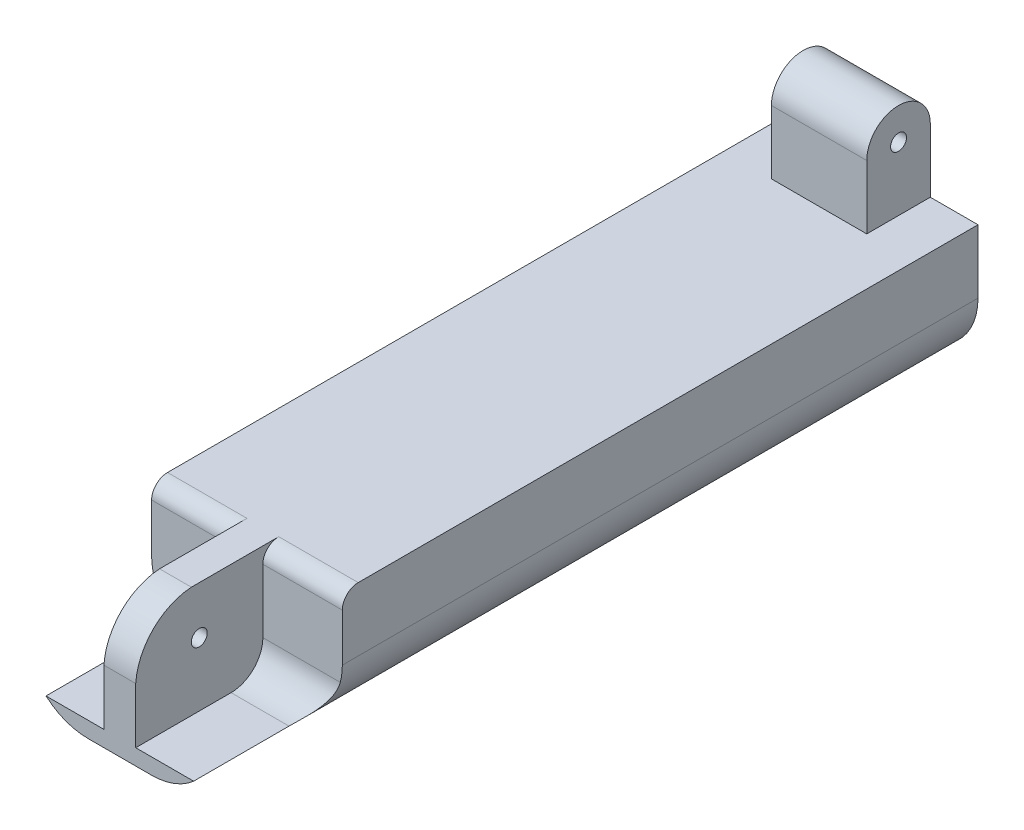
ISO-10303-21;
HEADER;
FILE_DESCRIPTION(('STEP AP214'),'2;1');
FILE_NAME('part.step','',(''),(''),'','','');
FILE_SCHEMA(('AUTOMOTIVE_DESIGN { 1 0 10303 214 1 1 1 1 }'));
ENDSEC;
DATA;
#1=APPLICATION_CONTEXT('core data for automotive mechanical design processes');
#2=APPLICATION_PROTOCOL_DEFINITION('international standard','automotive_design',2000,#1);
#3=PRODUCT_CONTEXT('',#1,'mechanical');
#4=PRODUCT('Part','Part','',(#3));
#5=PRODUCT_RELATED_PRODUCT_CATEGORY('part','',(#4));
#6=PRODUCT_DEFINITION_FORMATION('','',#4);
#7=PRODUCT_DEFINITION_CONTEXT('part definition',#1,'design');
#8=PRODUCT_DEFINITION('design','',#6,#7);
#9=PRODUCT_DEFINITION_SHAPE('','',#8);
#10=(LENGTH_UNIT() NAMED_UNIT(*) SI_UNIT(.MILLI.,.METRE.));
#11=(NAMED_UNIT(*) PLANE_ANGLE_UNIT() SI_UNIT($,.RADIAN.));
#12=(NAMED_UNIT(*) SI_UNIT($,.STERADIAN.) SOLID_ANGLE_UNIT());
#13=UNCERTAINTY_MEASURE_WITH_UNIT(LENGTH_MEASURE(1.E-05),#10,'distance_accuracy_value','');
#14=(GEOMETRIC_REPRESENTATION_CONTEXT(3) GLOBAL_UNCERTAINTY_ASSIGNED_CONTEXT((#13)) GLOBAL_UNIT_ASSIGNED_CONTEXT((#10,
#11,#12)) REPRESENTATION_CONTEXT('',''));
#15=CARTESIAN_POINT('',(0.,0.,0.));
#16=DIRECTION('',(0.,0.,1.));
#17=DIRECTION('',(1.,0.,0.));
#18=AXIS2_PLACEMENT_3D('',#15,#16,#17);
#19=CARTESIAN_POINT('',(0.,0.,0.));
#20=DIRECTION('',(0.,0.,1.));
#21=DIRECTION('',(1.,0.,0.));
#22=AXIS2_PLACEMENT_3D('',#19,#20,#21);
#23=PLANE('',#22);
#24=DIRECTION('',(1.,0.,0.));
#25=VECTOR('',#24,1.);
#26=CARTESIAN_POINT('',(-45.,60.,0.));
#27=LINE('',#26,#25);
#28=CARTESIAN_POINT('',(-45.,60.,0.));
#29=VERTEX_POINT('',#28);
#30=CARTESIAN_POINT('',(-15.,60.,0.));
#31=VERTEX_POINT('',#30);
#32=EDGE_CURVE('E179',#29,#31,#27,.T.);
#33=ORIENTED_EDGE('',*,*,#32,.T.);
#34=DIRECTION('',(0.,-1.,0.));
#35=VECTOR('',#34,1.);
#36=CARTESIAN_POINT('',(-15.,75.,0.));
#37=LINE('',#36,#35);
#38=CARTESIAN_POINT('',(-15.,40.,0.));
#39=VERTEX_POINT('',#38);
#40=EDGE_CURVE('E200',#31,#39,#37,.T.);
#41=ORIENTED_EDGE('',*,*,#40,.T.);
#42=DIRECTION('',(-1.,0.,0.));
#43=VECTOR('',#42,1.);
#44=CARTESIAN_POINT('',(0.,40.,0.));
#45=LINE('',#44,#43);
#46=CARTESIAN_POINT('',(0.,40.,0.));
#47=VERTEX_POINT('',#46);
#48=EDGE_CURVE('E267',#47,#39,#45,.T.);
#49=ORIENTED_EDGE('',*,*,#48,.F.);
#50=DIRECTION('',(0.,1.,0.));
#51=VECTOR('',#50,1.);
#52=CARTESIAN_POINT('',(0.,0.,0.));
#53=LINE('',#52,#51);
#54=CARTESIAN_POINT('',(0.,20.,0.));
#55=VERTEX_POINT('',#54);
#56=EDGE_CURVE('E239',#55,#47,#53,.T.);
#57=ORIENTED_EDGE('',*,*,#56,.F.);
#58=CARTESIAN_POINT('',(-20.,20.,0.));
#59=DIRECTION('',(0.,0.,1.));
#60=DIRECTION('',(-1.,0.,0.));
#61=AXIS2_PLACEMENT_3D('',#58,#59,#60);
#62=CIRCLE('',#61,20.);
#63=CARTESIAN_POINT('',(-20.,0.,0.));
#64=VERTEX_POINT('',#63);
#65=EDGE_CURVE('E395',#64,#55,#62,.T.);
#66=ORIENTED_EDGE('',*,*,#65,.F.);
#67=DIRECTION('',(1.,0.,0.));
#68=VECTOR('',#67,1.);
#69=CARTESIAN_POINT('',(0.,0.,0.));
#70=LINE('',#69,#68);
#71=CARTESIAN_POINT('',(-40.,0.,0.));
#72=VERTEX_POINT('',#71);
#73=EDGE_CURVE('E264',#72,#64,#70,.T.);
#74=ORIENTED_EDGE('',*,*,#73,.F.);
#75=CARTESIAN_POINT('',(-40.,20.,0.));
#76=DIRECTION('',(0.,0.,1.));
#77=DIRECTION('',(1.,0.,0.));
#78=AXIS2_PLACEMENT_3D('',#75,#76,#77);
#79=CIRCLE('',#78,20.);
#80=CARTESIAN_POINT('',(-60.,20.,0.));
#81=VERTEX_POINT('',#80);
#82=EDGE_CURVE('E400',#81,#72,#79,.T.);
#83=ORIENTED_EDGE('',*,*,#82,.F.);
#84=DIRECTION('',(0.,-1.,0.));
#85=VECTOR('',#84,1.);
#86=CARTESIAN_POINT('',(-60.,0.,0.));
#87=LINE('',#86,#85);
#88=CARTESIAN_POINT('',(-60.,40.,0.));
#89=VERTEX_POINT('',#88);
#90=EDGE_CURVE('E270',#89,#81,#87,.T.);
#91=ORIENTED_EDGE('',*,*,#90,.F.);
#92=CARTESIAN_POINT('',(-45.,40.,0.));
#93=VERTEX_POINT('',#92);
#94=EDGE_CURVE('E199',#93,#89,#45,.T.);
#95=ORIENTED_EDGE('',*,*,#94,.F.);
#96=DIRECTION('',(0.,-1.,0.));
#97=VECTOR('',#96,1.);
#98=CARTESIAN_POINT('',(-45.,75.,0.));
#99=LINE('',#98,#97);
#100=EDGE_CURVE('E192',#29,#93,#99,.T.);
#101=ORIENTED_EDGE('',*,*,#100,.F.);
#102=EDGE_LOOP('',(#33,#41,#49,#57,#66,#74,#83,#91,#95,#101));
#103=FACE_BOUND('',#102,.T.);
#104=ADVANCED_FACE('F38',(#103),#23,.F.);
#105=CARTESIAN_POINT('',(-60.,4.99999999999999,200.));
#106=DIRECTION('',(0.,0.,-1.));
#107=DIRECTION('',(-1.,0.,0.));
#108=AXIS2_PLACEMENT_3D('',#105,#106,#107);
#109=PLANE('',#108);
#110=DIRECTION('',(-1.,0.,0.));
#111=VECTOR('',#110,1.);
#112=CARTESIAN_POINT('',(-35.,35.0000000000034,200.));
#113=LINE('',#112,#111);
#114=CARTESIAN_POINT('',(-35.,35.0000000000034,200.));
#115=VERTEX_POINT('',#114);
#116=CARTESIAN_POINT('',(-60.,35.0000000000034,200.));
#117=VERTEX_POINT('',#116);
#118=EDGE_CURVE('E374',#115,#117,#113,.T.);
#119=ORIENTED_EDGE('',*,*,#118,.T.);
#120=DIRECTION('',(0.,1.,0.));
#121=VECTOR('',#120,1.);
#122=CARTESIAN_POINT('',(-60.,4.99999999999999,200.));
#123=LINE('',#122,#121);
#124=CARTESIAN_POINT('',(-60.,20.,200.));
#125=VERTEX_POINT('',#124);
#126=EDGE_CURVE('E236',#125,#117,#123,.T.);
#127=ORIENTED_EDGE('',*,*,#126,.F.);
#128=CARTESIAN_POINT('',(-40.,20.,200.));
#129=DIRECTION('',(0.,0.,-1.));
#130=DIRECTION('',(-1.,0.,0.));
#131=AXIS2_PLACEMENT_3D('',#128,#129,#130);
#132=CIRCLE('',#131,20.);
#133=CARTESIAN_POINT('',(-59.3649167310371,15.,200.));
#134=VERTEX_POINT('',#133);
#135=EDGE_CURVE('E418',#125,#134,#132,.F.);
#136=ORIENTED_EDGE('',*,*,#135,.T.);
#137=DIRECTION('',(1.,0.,0.));
#138=VECTOR('',#137,1.);
#139=CARTESIAN_POINT('',(-60.,15.,200.));
#140=LINE('',#139,#138);
#141=CARTESIAN_POINT('',(-35.,15.,200.));
#142=VERTEX_POINT('',#141);
#143=EDGE_CURVE('E217',#134,#142,#140,.T.);
#144=ORIENTED_EDGE('',*,*,#143,.T.);
#145=DIRECTION('',(0.,1.,0.));
#146=VECTOR('',#145,1.);
#147=CARTESIAN_POINT('',(-35.,4.99999999999999,200.));
#148=LINE('',#147,#146);
#149=EDGE_CURVE('E240',#142,#115,#148,.T.);
#150=ORIENTED_EDGE('',*,*,#149,.T.);
#151=EDGE_LOOP('',(#119,#127,#136,#144,#150));
#152=FACE_BOUND('',#151,.T.);
#153=ADVANCED_FACE('F327',(#152),#109,.F.);
#154=CARTESIAN_POINT('',(0.,0.,240.));
#155=DIRECTION('',(-1.,0.,0.));
#156=DIRECTION('',(0.,0.,1.));
#157=AXIS2_PLACEMENT_3D('',#154,#155,#156);
#158=PLANE('',#157);
#159=DIRECTION('',(0.,0.,-1.));
#160=VECTOR('',#159,1.);
#161=CARTESIAN_POINT('',(0.,40.,240.));
#162=LINE('',#161,#160);
#163=CARTESIAN_POINT('',(0.,40.,195.));
#164=VERTEX_POINT('',#163);
#165=EDGE_CURVE('E276',#164,#47,#162,.T.);
#166=ORIENTED_EDGE('',*,*,#165,.F.);
#167=CARTESIAN_POINT('',(0.,35.,195.));
#168=DIRECTION('',(-1.,0.,0.));
#169=DIRECTION('',(0.,0.,-1.));
#170=AXIS2_PLACEMENT_3D('',#167,#168,#169);
#171=CIRCLE('',#170,5.);
#172=CARTESIAN_POINT('',(0.,35.,200.));
#173=VERTEX_POINT('',#172);
#174=EDGE_CURVE('E376',#173,#164,#171,.T.);
#175=ORIENTED_EDGE('',*,*,#174,.F.);
#176=DIRECTION('',(0.,1.,0.));
#177=VECTOR('',#176,1.);
#178=CARTESIAN_POINT('',(0.,5.,200.));
#179=LINE('',#178,#177);
#180=CARTESIAN_POINT('',(0.,20.,200.));
#181=VERTEX_POINT('',#180);
#182=EDGE_CURVE('E250',#181,#173,#179,.T.);
#183=ORIENTED_EDGE('',*,*,#182,.F.);
#184=DIRECTION('',(0.,0.,-1.));
#185=VECTOR('',#184,1.);
#186=CARTESIAN_POINT('',(0.,20.,240.));
#187=LINE('',#186,#185);
#188=EDGE_CURVE('E411',#181,#55,#187,.T.);
#189=ORIENTED_EDGE('',*,*,#188,.T.);
#190=ORIENTED_EDGE('',*,*,#56,.T.);
#191=EDGE_LOOP('',(#166,#175,#183,#189,#190));
#192=FACE_BOUND('',#191,.T.);
#193=ADVANCED_FACE('F40',(#192),#158,.F.);
#194=CARTESIAN_POINT('',(0.,40.,240.));
#195=DIRECTION('',(0.,-1.,0.));
#196=DIRECTION('',(1.,0.,0.));
#197=AXIS2_PLACEMENT_3D('',#194,#195,#196);
#198=PLANE('',#197);
#199=DIRECTION('',(0.,0.,-1.));
#200=VECTOR('',#199,1.);
#201=CARTESIAN_POINT('',(-60.,40.,240.));
#202=LINE('',#201,#200);
#203=CARTESIAN_POINT('',(-60.,40.,195.));
#204=VERTEX_POINT('',#203);
#205=EDGE_CURVE('E263',#204,#89,#202,.T.);
#206=ORIENTED_EDGE('',*,*,#205,.F.);
#207=DIRECTION('',(-1.,0.,0.));
#208=VECTOR('',#207,1.);
#209=CARTESIAN_POINT('',(-35.,40.,195.));
#210=LINE('',#209,#208);
#211=CARTESIAN_POINT('',(-35.,40.,195.));
#212=VERTEX_POINT('',#211);
#213=EDGE_CURVE('E61',#212,#204,#210,.T.);
#214=ORIENTED_EDGE('',*,*,#213,.F.);
#215=DIRECTION('',(0.,0.,-1.));
#216=VECTOR('',#215,1.);
#217=CARTESIAN_POINT('',(-35.,40.,240.));
#218=LINE('',#217,#216);
#219=CARTESIAN_POINT('',(-35.,40.,222.5));
#220=VERTEX_POINT('',#219);
#221=EDGE_CURVE('E230',#220,#212,#218,.T.);
#222=ORIENTED_EDGE('',*,*,#221,.F.);
#223=DIRECTION('',(1.,0.,0.));
#224=VECTOR('',#223,1.);
#225=CARTESIAN_POINT('',(-45.,40.,222.5));
#226=LINE('',#225,#224);
#227=CARTESIAN_POINT('',(-25.,40.,222.5));
#228=VERTEX_POINT('',#227);
#229=EDGE_CURVE('E389',#220,#228,#226,.T.);
#230=ORIENTED_EDGE('',*,*,#229,.T.);
#231=DIRECTION('',(0.,0.,1.));
#232=VECTOR('',#231,1.);
#233=CARTESIAN_POINT('',(-25.,40.,240.));
#234=LINE('',#233,#232);
#235=CARTESIAN_POINT('',(-25.,40.,195.));
#236=VERTEX_POINT('',#235);
#237=EDGE_CURVE('E226',#236,#228,#234,.T.);
#238=ORIENTED_EDGE('',*,*,#237,.F.);
#239=DIRECTION('',(1.,0.,0.));
#240=VECTOR('',#239,1.);
#241=CARTESIAN_POINT('',(-25.,40.,195.));
#242=LINE('',#241,#240);
#243=EDGE_CURVE('E383',#236,#164,#242,.T.);
#244=ORIENTED_EDGE('',*,*,#243,.T.);
#245=ORIENTED_EDGE('',*,*,#165,.T.);
#246=ORIENTED_EDGE('',*,*,#48,.T.);
#247=DIRECTION('',(0.,0.,-1.));
#248=VECTOR('',#247,1.);
#249=CARTESIAN_POINT('',(-15.,40.,0.));
#250=LINE('',#249,#248);
#251=CARTESIAN_POINT('',(-15.,40.,20.));
#252=VERTEX_POINT('',#251);
#253=EDGE_CURVE('E201',#252,#39,#250,.T.);
#254=ORIENTED_EDGE('',*,*,#253,.F.);
#255=DIRECTION('',(1.,0.,0.));
#256=VECTOR('',#255,1.);
#257=CARTESIAN_POINT('',(-45.,40.,20.));
#258=LINE('',#257,#256);
#259=CARTESIAN_POINT('',(-45.,40.,20.));
#260=VERTEX_POINT('',#259);
#261=EDGE_CURVE('E206',#260,#252,#258,.T.);
#262=ORIENTED_EDGE('',*,*,#261,.F.);
#263=DIRECTION('',(0.,0.,1.));
#264=VECTOR('',#263,1.);
#265=CARTESIAN_POINT('',(-45.,40.,0.));
#266=LINE('',#265,#264);
#267=EDGE_CURVE('E432',#93,#260,#266,.T.);
#268=ORIENTED_EDGE('',*,*,#267,.F.);
#269=ORIENTED_EDGE('',*,*,#94,.T.);
#270=EDGE_LOOP('',(#206,#214,#222,#230,#238,#244,#245,#246,#254,#262,#268,#269));
#271=FACE_BOUND('',#270,.T.);
#272=ADVANCED_FACE('F348',(#271),#198,.F.);
#273=CARTESIAN_POINT('',(-35.,4.99999999999999,240.));
#274=DIRECTION('',(1.,0.,0.));
#275=DIRECTION('',(0.,1.,0.));
#276=AXIS2_PLACEMENT_3D('',#273,#274,#275);
#277=PLANE('',#276);
#278=CARTESIAN_POINT('',(-35.,25.,220.));
#279=DIRECTION('',(1.,0.,0.));
#280=DIRECTION('',(0.,1.,0.));
#281=AXIS2_PLACEMENT_3D('',#278,#279,#280);
#282=CIRCLE('',#281,2.5);
#283=CARTESIAN_POINT('',(-35.,27.5,220.));
#284=VERTEX_POINT('',#283);
#285=EDGE_CURVE('E429',#284,#284,#282,.T.);
#286=ORIENTED_EDGE('',*,*,#285,.T.);
#287=EDGE_LOOP('',(#286));
#288=FACE_BOUND('',#287,.T.);
#289=DIRECTION('',(0.,1.,0.));
#290=VECTOR('',#289,1.);
#291=CARTESIAN_POINT('',(-35.,4.99999999999999,240.));
#292=LINE('',#291,#290);
#293=CARTESIAN_POINT('',(-35.,4.99999999999999,240.));
#294=VERTEX_POINT('',#293);
#295=CARTESIAN_POINT('',(-35.,22.5,240.));
#296=VERTEX_POINT('',#295);
#297=EDGE_CURVE('E233',#294,#296,#292,.T.);
#298=ORIENTED_EDGE('',*,*,#297,.T.);
#299=CARTESIAN_POINT('',(-35.,21.25,221.25));
#300=DIRECTION('',(1.,0.,0.));
#301=DIRECTION('',(0.,1.,0.));
#302=AXIS2_PLACEMENT_3D('',#299,#300,#301);
#303=CIRCLE('',#302,18.7916204729662);
#304=EDGE_CURVE('E392',#296,#220,#303,.F.);
#305=ORIENTED_EDGE('',*,*,#304,.T.);
#306=ORIENTED_EDGE('',*,*,#221,.T.);
#307=CARTESIAN_POINT('',(-35.,35.,195.));
#308=DIRECTION('',(1.,0.,0.));
#309=DIRECTION('',(0.,0.,1.));
#310=AXIS2_PLACEMENT_3D('',#307,#308,#309);
#311=CIRCLE('',#310,5.00000000000001);
#312=EDGE_CURVE('E365',#212,#115,#311,.T.);
#313=ORIENTED_EDGE('',*,*,#312,.T.);
#314=ORIENTED_EDGE('',*,*,#149,.F.);
#315=CARTESIAN_POINT('',(-35.,15.,210.));
#316=DIRECTION('',(1.,0.,0.));
#317=DIRECTION('',(0.,-1.,0.));
#318=AXIS2_PLACEMENT_3D('',#315,#316,#317);
#319=CIRCLE('',#318,10.);
#320=CARTESIAN_POINT('',(-35.,4.99999999999999,210.));
#321=VERTEX_POINT('',#320);
#322=EDGE_CURVE('E212',#321,#142,#319,.T.);
#323=ORIENTED_EDGE('',*,*,#322,.F.);
#324=DIRECTION('',(0.,0.,-1.));
#325=VECTOR('',#324,1.);
#326=CARTESIAN_POINT('',(-35.,4.99999999999999,240.));
#327=LINE('',#326,#325);
#328=EDGE_CURVE('E229',#294,#321,#327,.T.);
#329=ORIENTED_EDGE('',*,*,#328,.F.);
#330=EDGE_LOOP('',(#298,#305,#306,#313,#314,#323,#329));
#331=FACE_BOUND('',#330,.T.);
#332=ADVANCED_FACE('F350',(#288,#331),#277,.F.);
#333=CARTESIAN_POINT('',(-25.,5.,240.));
#334=DIRECTION('',(-1.,0.,0.));
#335=DIRECTION('',(0.,-1.,0.));
#336=AXIS2_PLACEMENT_3D('',#333,#334,#335);
#337=PLANE('',#336);
#338=CARTESIAN_POINT('',(-25.,25.,220.));
#339=DIRECTION('',(1.,0.,0.));
#340=DIRECTION('',(0.,1.,0.));
#341=AXIS2_PLACEMENT_3D('',#338,#339,#340);
#342=CIRCLE('',#341,2.5);
#343=CARTESIAN_POINT('',(-25.,27.5,220.));
#344=VERTEX_POINT('',#343);
#345=EDGE_CURVE('E426',#344,#344,#342,.T.);
#346=ORIENTED_EDGE('',*,*,#345,.F.);
#347=EDGE_LOOP('',(#346));
#348=FACE_BOUND('',#347,.T.);
#349=ORIENTED_EDGE('',*,*,#237,.T.);
#350=CARTESIAN_POINT('',(-25.,21.25,221.25));
#351=DIRECTION('',(1.,0.,0.));
#352=DIRECTION('',(0.,1.,0.));
#353=AXIS2_PLACEMENT_3D('',#350,#351,#352);
#354=CIRCLE('',#353,18.7916204729662);
#355=CARTESIAN_POINT('',(-25.,22.5,240.));
#356=VERTEX_POINT('',#355);
#357=EDGE_CURVE('E386',#356,#228,#354,.F.);
#358=ORIENTED_EDGE('',*,*,#357,.F.);
#359=DIRECTION('',(0.,1.,0.));
#360=VECTOR('',#359,1.);
#361=CARTESIAN_POINT('',(-25.,5.,240.));
#362=LINE('',#361,#360);
#363=CARTESIAN_POINT('',(-25.,5.,240.));
#364=VERTEX_POINT('',#363);
#365=EDGE_CURVE('E235',#364,#356,#362,.T.);
#366=ORIENTED_EDGE('',*,*,#365,.F.);
#367=DIRECTION('',(0.,0.,1.));
#368=VECTOR('',#367,1.);
#369=CARTESIAN_POINT('',(-25.,5.,240.));
#370=LINE('',#369,#368);
#371=CARTESIAN_POINT('',(-25.,5.,210.));
#372=VERTEX_POINT('',#371);
#373=EDGE_CURVE('E245',#372,#364,#370,.T.);
#374=ORIENTED_EDGE('',*,*,#373,.F.);
#375=CARTESIAN_POINT('',(-25.,15.,210.));
#376=DIRECTION('',(-1.,0.,0.));
#377=DIRECTION('',(0.,1.,0.));
#378=AXIS2_PLACEMENT_3D('',#375,#376,#377);
#379=CIRCLE('',#378,10.);
#380=CARTESIAN_POINT('',(-25.,15.,200.));
#381=VERTEX_POINT('',#380);
#382=EDGE_CURVE('E219',#381,#372,#379,.T.);
#383=ORIENTED_EDGE('',*,*,#382,.F.);
#384=DIRECTION('',(0.,1.,0.));
#385=VECTOR('',#384,1.);
#386=CARTESIAN_POINT('',(-25.,5.,200.));
#387=LINE('',#386,#385);
#388=CARTESIAN_POINT('',(-25.,35.,200.));
#389=VERTEX_POINT('',#388);
#390=EDGE_CURVE('E255',#381,#389,#387,.T.);
#391=ORIENTED_EDGE('',*,*,#390,.T.);
#392=CARTESIAN_POINT('',(-25.,35.,195.));
#393=DIRECTION('',(-1.,0.,0.));
#394=DIRECTION('',(0.,0.,-1.));
#395=AXIS2_PLACEMENT_3D('',#392,#393,#394);
#396=CIRCLE('',#395,5.);
#397=EDGE_CURVE('E378',#389,#236,#396,.T.);
#398=ORIENTED_EDGE('',*,*,#397,.T.);
#399=EDGE_LOOP('',(#349,#358,#366,#374,#383,#391,#398));
#400=FACE_BOUND('',#399,.T.);
#401=ADVANCED_FACE('F342',(#348,#400),#337,.F.);
#402=CARTESIAN_POINT('',(0.,0.,240.));
#403=DIRECTION('',(0.,1.,0.));
#404=DIRECTION('',(0.,0.,1.));
#405=AXIS2_PLACEMENT_3D('',#402,#403,#404);
#406=PLANE('',#405);
#407=DIRECTION('',(0.,0.,-1.));
#408=VECTOR('',#407,1.);
#409=CARTESIAN_POINT('',(-40.,0.,240.));
#410=LINE('',#409,#408);
#411=CARTESIAN_POINT('',(-40.,0.,240.));
#412=VERTEX_POINT('',#411);
#413=EDGE_CURVE('E399',#412,#72,#410,.T.);
#414=ORIENTED_EDGE('',*,*,#413,.T.);
#415=ORIENTED_EDGE('',*,*,#73,.T.);
#416=DIRECTION('',(0.,0.,-1.));
#417=VECTOR('',#416,1.);
#418=CARTESIAN_POINT('',(-20.,0.,240.));
#419=LINE('',#418,#417);
#420=CARTESIAN_POINT('',(-20.,0.,240.));
#421=VERTEX_POINT('',#420);
#422=EDGE_CURVE('E402',#421,#64,#419,.T.);
#423=ORIENTED_EDGE('',*,*,#422,.F.);
#424=DIRECTION('',(1.,0.,0.));
#425=VECTOR('',#424,1.);
#426=CARTESIAN_POINT('',(0.,0.,240.));
#427=LINE('',#426,#425);
#428=EDGE_CURVE('E260',#412,#421,#427,.T.);
#429=ORIENTED_EDGE('',*,*,#428,.F.);
#430=EDGE_LOOP('',(#414,#415,#423,#429));
#431=FACE_BOUND('',#430,.T.);
#432=ADVANCED_FACE('F338',(#431),#406,.F.);
#433=CARTESIAN_POINT('',(0.,4.99999999999999,0.));
#434=DIRECTION('',(0.,-1.,0.));
#435=DIRECTION('',(0.,0.,-1.));
#436=AXIS2_PLACEMENT_3D('',#433,#434,#435);
#437=PLANE('',#436);
#438=DIRECTION('',(1.,0.,0.));
#439=VECTOR('',#438,1.);
#440=CARTESIAN_POINT('',(-60.,4.99999999999999,210.));
#441=LINE('',#440,#439);
#442=CARTESIAN_POINT('',(-53.2287565553229,4.99999999999999,210.));
#443=VERTEX_POINT('',#442);
#444=EDGE_CURVE('E215',#443,#321,#441,.T.);
#445=ORIENTED_EDGE('',*,*,#444,.F.);
#446=DIRECTION('',(0.,0.,-1.));
#447=VECTOR('',#446,1.);
#448=CARTESIAN_POINT('',(-53.2287565553229,4.99999999999999,240.));
#449=LINE('',#448,#447);
#450=CARTESIAN_POINT('',(-53.2287565553229,4.99999999999999,240.));
#451=VERTEX_POINT('',#450);
#452=EDGE_CURVE('E405',#443,#451,#449,.F.);
#453=ORIENTED_EDGE('',*,*,#452,.T.);
#454=DIRECTION('',(1.,0.,0.));
#455=VECTOR('',#454,1.);
#456=CARTESIAN_POINT('',(-60.,4.99999999999999,240.));
#457=LINE('',#456,#455);
#458=EDGE_CURVE('E227',#451,#294,#457,.T.);
#459=ORIENTED_EDGE('',*,*,#458,.T.);
#460=ORIENTED_EDGE('',*,*,#328,.T.);
#461=EDGE_LOOP('',(#445,#453,#459,#460));
#462=FACE_BOUND('',#461,.T.);
#463=ADVANCED_FACE('F341',(#462),#437,.F.);
#464=CARTESIAN_POINT('',(0.,5.,200.));
#465=DIRECTION('',(0.,0.,-1.));
#466=DIRECTION('',(-1.,0.,0.));
#467=AXIS2_PLACEMENT_3D('',#464,#465,#466);
#468=PLANE('',#467);
#469=ORIENTED_EDGE('',*,*,#182,.T.);
#470=DIRECTION('',(1.,0.,0.));
#471=VECTOR('',#470,1.);
#472=CARTESIAN_POINT('',(-25.,35.,200.));
#473=LINE('',#472,#471);
#474=EDGE_CURVE('E381',#389,#173,#473,.T.);
#475=ORIENTED_EDGE('',*,*,#474,.F.);
#476=ORIENTED_EDGE('',*,*,#390,.F.);
#477=DIRECTION('',(-1.,0.,0.));
#478=VECTOR('',#477,1.);
#479=CARTESIAN_POINT('',(0.,15.,200.));
#480=LINE('',#479,#478);
#481=CARTESIAN_POINT('',(-0.635083268962916,15.,200.));
#482=VERTEX_POINT('',#481);
#483=EDGE_CURVE('E222',#482,#381,#480,.T.);
#484=ORIENTED_EDGE('',*,*,#483,.F.);
#485=CARTESIAN_POINT('',(-20.,20.,200.));
#486=DIRECTION('',(0.,0.,-1.));
#487=DIRECTION('',(-1.,0.,0.));
#488=AXIS2_PLACEMENT_3D('',#485,#486,#487);
#489=CIRCLE('',#488,20.);
#490=EDGE_CURVE('E423',#482,#181,#489,.F.);
#491=ORIENTED_EDGE('',*,*,#490,.T.);
#492=EDGE_LOOP('',(#469,#475,#476,#484,#491));
#493=FACE_BOUND('',#492,.T.);
#494=ADVANCED_FACE('F491',(#493),#468,.F.);
#495=CARTESIAN_POINT('',(0.,5.,0.));
#496=DIRECTION('',(0.,1.,0.));
#497=DIRECTION('',(0.,0.,1.));
#498=AXIS2_PLACEMENT_3D('',#495,#496,#497);
#499=PLANE('',#498);
#500=DIRECTION('',(0.,0.,-1.));
#501=VECTOR('',#500,1.);
#502=CARTESIAN_POINT('',(-6.77124344467705,5.,240.));
#503=LINE('',#502,#501);
#504=CARTESIAN_POINT('',(-6.77124344467705,4.99999999999999,210.));
#505=VERTEX_POINT('',#504);
#506=CARTESIAN_POINT('',(-6.77124344467705,5.,240.));
#507=VERTEX_POINT('',#506);
#508=EDGE_CURVE('E421',#505,#507,#503,.F.);
#509=ORIENTED_EDGE('',*,*,#508,.F.);
#510=DIRECTION('',(-1.,0.,0.));
#511=VECTOR('',#510,1.);
#512=CARTESIAN_POINT('',(0.,5.,210.));
#513=LINE('',#512,#511);
#514=EDGE_CURVE('E224',#505,#372,#513,.T.);
#515=ORIENTED_EDGE('',*,*,#514,.T.);
#516=ORIENTED_EDGE('',*,*,#373,.T.);
#517=DIRECTION('',(1.,0.,0.));
#518=VECTOR('',#517,1.);
#519=CARTESIAN_POINT('',(0.,5.,240.));
#520=LINE('',#519,#518);
#521=EDGE_CURVE('E247',#364,#507,#520,.T.);
#522=ORIENTED_EDGE('',*,*,#521,.T.);
#523=EDGE_LOOP('',(#509,#515,#516,#522));
#524=FACE_BOUND('',#523,.T.);
#525=ADVANCED_FACE('F346',(#524),#499,.T.);
#526=CARTESIAN_POINT('',(-60.,0.,240.));
#527=DIRECTION('',(1.,0.,0.));
#528=DIRECTION('',(0.,0.,-1.));
#529=AXIS2_PLACEMENT_3D('',#526,#527,#528);
#530=PLANE('',#529);
#531=ORIENTED_EDGE('',*,*,#126,.T.);
#532=CARTESIAN_POINT('',(-60.,35.,195.));
#533=DIRECTION('',(1.,0.,0.));
#534=DIRECTION('',(0.,0.,1.));
#535=AXIS2_PLACEMENT_3D('',#532,#533,#534);
#536=CIRCLE('',#535,5.00000000000001);
#537=EDGE_CURVE('E362',#204,#117,#536,.T.);
#538=ORIENTED_EDGE('',*,*,#537,.F.);
#539=ORIENTED_EDGE('',*,*,#205,.T.);
#540=ORIENTED_EDGE('',*,*,#90,.T.);
#541=DIRECTION('',(0.,0.,-1.));
#542=VECTOR('',#541,1.);
#543=CARTESIAN_POINT('',(-60.,20.,240.));
#544=LINE('',#543,#542);
#545=EDGE_CURVE('E403',#125,#81,#544,.T.);
#546=ORIENTED_EDGE('',*,*,#545,.F.);
#547=EDGE_LOOP('',(#531,#538,#539,#540,#546));
#548=FACE_BOUND('',#547,.T.);
#549=ADVANCED_FACE('F344',(#548),#530,.F.);
#550=CARTESIAN_POINT('',(0.,0.,240.));
#551=DIRECTION('',(0.,0.,1.));
#552=DIRECTION('',(1.,0.,0.));
#553=AXIS2_PLACEMENT_3D('',#550,#551,#552);
#554=PLANE('',#553);
#555=DIRECTION('',(1.,0.,0.));
#556=VECTOR('',#555,1.);
#557=CARTESIAN_POINT('',(-45.,22.5,240.));
#558=LINE('',#557,#556);
#559=EDGE_CURVE('E11',#296,#356,#558,.T.);
#560=ORIENTED_EDGE('',*,*,#559,.F.);
#561=ORIENTED_EDGE('',*,*,#297,.F.);
#562=ORIENTED_EDGE('',*,*,#458,.F.);
#563=CARTESIAN_POINT('',(-40.,20.,240.));
#564=DIRECTION('',(0.,0.,1.));
#565=DIRECTION('',(1.,0.,0.));
#566=AXIS2_PLACEMENT_3D('',#563,#564,#565);
#567=CIRCLE('',#566,20.);
#568=EDGE_CURVE('E396',#451,#412,#567,.T.);
#569=ORIENTED_EDGE('',*,*,#568,.T.);
#570=ORIENTED_EDGE('',*,*,#428,.T.);
#571=CARTESIAN_POINT('',(-20.,20.,240.));
#572=DIRECTION('',(0.,0.,1.));
#573=DIRECTION('',(-1.,0.,0.));
#574=AXIS2_PLACEMENT_3D('',#571,#572,#573);
#575=CIRCLE('',#574,20.);
#576=EDGE_CURVE('E408',#421,#507,#575,.T.);
#577=ORIENTED_EDGE('',*,*,#576,.T.);
#578=ORIENTED_EDGE('',*,*,#521,.F.);
#579=ORIENTED_EDGE('',*,*,#365,.T.);
#580=EDGE_LOOP('',(#560,#561,#562,#569,#570,#577,#578,#579));
#581=FACE_BOUND('',#580,.T.);
#582=ADVANCED_FACE('F336',(#581),#554,.T.);
#583=CARTESIAN_POINT('',(0.,15.,210.));
#584=DIRECTION('',(-1.,0.,0.));
#585=DIRECTION('',(0.,-1.,0.));
#586=AXIS2_PLACEMENT_3D('',#583,#584,#585);
#587=CYLINDRICAL_SURFACE('',#586,10.);
#588=ORIENTED_EDGE('',*,*,#514,.F.);
#589=CARTESIAN_POINT('',(-6.77124344467705,4.99999999999999,210.));
#590=CARTESIAN_POINT('',(-6.77124950362236,4.99999756391242,209.885044374026));
#591=CARTESIAN_POINT('',(-6.76899469072147,5.00198289434312,209.770110341972));
#592=CARTESIAN_POINT('',(-6.7600246117148,5.00989977690022,209.540567053226));
#593=CARTESIAN_POINT('',(-6.75330991933257,5.015830821446,209.425957756663));
#594=CARTESIAN_POINT('',(-6.726602455376,5.03946800989276,209.083448860173));
#595=CARTESIAN_POINT('',(-6.70004580200457,5.06301846052821,208.856409667569));
#596=CARTESIAN_POINT('',(-6.63111522536106,5.12468493109656,208.409927877289));
#597=CARTESIAN_POINT('',(-6.58895174877605,5.16260731141423,208.19042485932));
#598=CARTESIAN_POINT('',(-6.49049919270945,5.25219303771506,207.757420819147));
#599=CARTESIAN_POINT('',(-6.43420475392797,5.30386159751172,207.543922108372));
#600=CARTESIAN_POINT('',(-6.30989967837243,5.41959220143996,207.12552739996));
#601=CARTESIAN_POINT('',(-6.24197067998354,5.48356824680569,206.920583066526));
#602=CARTESIAN_POINT('',(-6.09611776015524,5.62320332730469,206.518478003213));
#603=CARTESIAN_POINT('',(-6.01819471009431,5.69886134400739,206.321316596701));
#604=CARTESIAN_POINT('',(-5.77155894446648,5.94280267192164,205.740419489683));
#605=CARTESIAN_POINT('',(-5.59043872720965,6.1276388084162,205.368734485533));
#606=CARTESIAN_POINT('',(-5.2534747833923,6.48756891470327,204.742974617657));
#607=CARTESIAN_POINT('',(-5.10177363602224,6.65464146021493,204.481864511075));
#608=CARTESIAN_POINT('',(-4.79099458982943,7.00993382542087,203.978902439286));
#609=CARTESIAN_POINT('',(-4.63191370147873,7.19816226006754,203.737058388467));
#610=CARTESIAN_POINT('',(-4.30999352421674,7.5947975846449,203.272717214933));
#611=CARTESIAN_POINT('',(-4.14715029446408,7.80322643783523,203.050241661156));
#612=CARTESIAN_POINT('',(-3.82102778838818,8.23926149026272,202.625378534788));
#613=CARTESIAN_POINT('',(-3.65774857326464,8.46686512219001,202.422988280857));
#614=CARTESIAN_POINT('',(-3.33131799254826,8.94379471468735,202.036466968517));
#615=CARTESIAN_POINT('',(-3.16819826584742,9.19337297823248,201.852620106205));
#616=CARTESIAN_POINT('',(-2.84698940650044,9.71083286618093,201.507567633574));
#617=CARTESIAN_POINT('',(-2.68890071248837,9.97871608014095,201.346363993261));
#618=CARTESIAN_POINT('',(-2.38078035241441,10.5309575996312,201.048701830715));
#619=CARTESIAN_POINT('',(-2.23072483136024,10.8152612373746,200.912166813056));
#620=CARTESIAN_POINT('',(-1.9405651688409,11.3998142536384,200.665158288334));
#621=CARTESIAN_POINT('',(-1.80045851436125,11.7000595716719,200.554678183497));
#622=CARTESIAN_POINT('',(-1.56394493133504,12.2425676078197,200.384525989647));
#623=CARTESIAN_POINT('',(-1.46499764764006,12.4819064076997,200.319014876057));
#624=CARTESIAN_POINT('',(-1.27525428648985,12.9677955171901,200.205493154798));
#625=CARTESIAN_POINT('',(-1.18445551295536,13.2143434054826,200.157476742487));
#626=CARTESIAN_POINT('',(-1.01141055673733,13.7147936377278,200.079684342234));
#627=CARTESIAN_POINT('',(-0.929213006557339,13.9687284082521,200.05000786075));
#628=CARTESIAN_POINT('',(-0.774599274629181,14.4812929332496,200.010143431472));
#629=CARTESIAN_POINT('',(-0.70219149034395,14.7399265052652,199.999972117466));
#630=CARTESIAN_POINT('',(-0.635083268962914,15.,200.));
#631=B_SPLINE_CURVE_WITH_KNOTS('',3,(#589,#590,#591,#592,#593,#594,#595,#596,#597,#598,#599,
#600,#601,#602,#603,#604,#605,#606,#607,#608,#609,#610,#611,#612,#613,#614,#615,#616,#617,#618,
#619,#620,#621,#622,#623,#624,#625,#626,#627,#628,#629,#630),.UNSPECIFIED.,.F.,.F.,(4,2,2,2,2,2,
2,2,2,2,2,2,2,2,2,2,2,2,2,2,4),(0.,0.344785660693793,0.68952697638908,1.37764051445121,
2.05679465008612,2.73620675149118,3.41103341297659,4.08580127646908,5.44005936332914,
6.47425958476947,7.50888248229094,8.54464318835487,9.58026543621405,10.6299039915249,
11.6796338109739,12.7260504409358,13.7722018061203,14.5729009915764,15.3733342671476,
16.1780731554765,16.9834980114196),.UNSPECIFIED.);
#632=EDGE_CURVE('E46',#505,#482,#631,.T.);
#633=ORIENTED_EDGE('',*,*,#632,.T.);
#634=ORIENTED_EDGE('',*,*,#483,.T.);
#635=ORIENTED_EDGE('',*,*,#382,.T.);
#636=EDGE_LOOP('',(#588,#633,#634,#635));
#637=FACE_BOUND('',#636,.T.);
#638=ADVANCED_FACE('F323',(#637),#587,.F.);
#639=CARTESIAN_POINT('',(-60.,15.,210.));
#640=DIRECTION('',(1.,0.,0.));
#641=DIRECTION('',(0.,1.,0.));
#642=AXIS2_PLACEMENT_3D('',#639,#640,#641);
#643=CYLINDRICAL_SURFACE('',#642,10.);
#644=ORIENTED_EDGE('',*,*,#143,.F.);
#645=CARTESIAN_POINT('',(-59.3649167310371,15.,200.));
#646=CARTESIAN_POINT('',(-59.3279095088461,14.8566629082111,199.999999266484));
#647=CARTESIAN_POINT('',(-59.2893123802264,14.7137621738816,200.003082306262));
#648=CARTESIAN_POINT('',(-59.209033911639,14.4291050188681,200.01529305131));
#649=CARTESIAN_POINT('',(-59.1673528941272,14.2873484802597,200.024420125398));
#650=CARTESIAN_POINT('',(-59.037914006822,13.864480215768,200.060656461431));
#651=CARTESIAN_POINT('',(-58.9456752673688,13.5854409644224,200.096621411267));
#652=CARTESIAN_POINT('',(-58.7510211897768,13.037000243955,200.190639065209));
#653=CARTESIAN_POINT('',(-58.6486790311321,12.7675462873333,200.248540475502));
#654=CARTESIAN_POINT('',(-58.4344774678329,12.2378045312006,200.385162006283));
#655=CARTESIAN_POINT('',(-58.3226160218022,11.9775187147699,200.463886599895));
#656=CARTESIAN_POINT('',(-58.0911550007272,11.4684098566964,200.64050151253));
#657=CARTESIAN_POINT('',(-57.9715857567444,11.2195477785408,200.738319451996));
#658=CARTESIAN_POINT('',(-57.7257211330498,10.7332285896732,200.952060349331));
#659=CARTESIAN_POINT('',(-57.5994261064796,10.4957708814102,201.06798235725));
#660=CARTESIAN_POINT('',(-57.3412439757085,10.0324655991094,201.317089422939));
#661=CARTESIAN_POINT('',(-57.2093452248958,9.80664460441028,201.45031174972));
#662=CARTESIAN_POINT('',(-56.941684198397,9.36771760626029,201.732864339168));
#663=CARTESIAN_POINT('',(-56.805921527249,9.15461291125053,201.882196255005));
#664=CARTESIAN_POINT('',(-56.5135579157039,8.71365859625265,202.217413927981));
#665=CARTESIAN_POINT('',(-56.3566210639332,8.48771030193913,202.405512165857));
#666=CARTESIAN_POINT('',(-56.0421487192218,8.05339550961257,202.800632108501));
#667=CARTESIAN_POINT('',(-55.8846131308112,7.84503194997834,203.007656963881));
#668=CARTESIAN_POINT('',(-55.5716773741756,7.44663367330531,203.440040653764));
#669=CARTESIAN_POINT('',(-55.4162767441076,7.25659493687334,203.665395447669));
#670=CARTESIAN_POINT('',(-55.1106815091322,6.89568137533688,204.134208905962));
#671=CARTESIAN_POINT('',(-54.9604855210273,6.72480143113809,204.377662705371));
#672=CARTESIAN_POINT('',(-54.7023238853168,6.44014351664167,204.824855348244));
#673=CARTESIAN_POINT('',(-54.5925572512584,6.32224500138773,205.024939984363));
#674=CARTESIAN_POINT('',(-54.3802944069595,6.09925129017602,205.435866791188));
#675=CARTESIAN_POINT('',(-54.2777981234281,5.99415596514403,205.646708853414));
#676=CARTESIAN_POINT('',(-54.0825130246496,5.79781766657762,206.078765429212));
#677=CARTESIAN_POINT('',(-53.9897130671177,5.70655873765021,206.299967604617));
#678=CARTESIAN_POINT('',(-53.8163463842519,5.5389101797023,206.752546238086));
#679=CARTESIAN_POINT('',(-53.7357748549892,5.46251470824121,206.98391865447));
#680=CARTESIAN_POINT('',(-53.6054895760844,5.3406409209436,207.405022763634));
#681=CARTESIAN_POINT('',(-53.5528695187781,5.29204871555056,207.59295649072));
#682=CARTESIAN_POINT('',(-53.4583161819421,5.20547940420214,207.973806475642));
#683=CARTESIAN_POINT('',(-53.4163765641797,5.16749600122564,208.166719703206));
#684=CARTESIAN_POINT('',(-53.3445177950629,5.10281289587908,208.556194829502));
#685=CARTESIAN_POINT('',(-53.314572272101,5.07608843151273,208.752747718196));
#686=CARTESIAN_POINT('',(-53.2676198767741,5.03433043076783,209.148547389065));
#687=CARTESIAN_POINT('',(-53.2506045085525,5.01928921767568,209.347792314658));
#688=CARTESIAN_POINT('',(-53.2364950931246,5.00682777160517,209.62289765287));
#689=CARTESIAN_POINT('',(-53.2335943196447,5.00426768556149,209.698284245503));
#690=CARTESIAN_POINT('',(-53.2297253940796,5.0008542536134,209.849110697172));
#691=CARTESIAN_POINT('',(-53.2287563495583,5.00000011957866,209.924550515495));
#692=CARTESIAN_POINT('',(-53.2287565553229,4.99999999999999,210.));
#693=B_SPLINE_CURVE_WITH_KNOTS('',3,(#645,#646,#647,#648,#649,#650,#651,#652,#653,#654,#655,
#656,#657,#658,#659,#660,#661,#662,#663,#664,#665,#666,#667,#668,#669,#670,#671,#672,#673,#674,
#675,#676,#677,#678,#679,#680,#681,#682,#683,#684,#685,#686,#687,#688,#689,#690,#691,#692),
.UNSPECIFIED.,.F.,.F.,(4,2,2,2,2,2,2,2,2,2,2,2,2,2,2,2,2,2,2,2,2,2,2,4),(0.,0.444023663320067,
0.888000964328865,1.77494040947669,2.65587090024862,3.53699078167697,4.41483318109793,
5.29262953420741,6.17234925177704,7.05215933239673,8.05090927669048,9.04982578129739,
10.0485226813319,11.0469520974439,11.8169921350954,12.5870244090144,13.3561618564906,
14.1249963624088,14.7277962350945,15.3302375423593,15.9313468834955,16.5320609188311,
16.7584837526745,16.984801957539),.UNSPECIFIED.);
#694=EDGE_CURVE('E278',#134,#443,#693,.T.);
#695=ORIENTED_EDGE('',*,*,#694,.T.);
#696=ORIENTED_EDGE('',*,*,#444,.T.);
#697=ORIENTED_EDGE('',*,*,#322,.T.);
#698=EDGE_LOOP('',(#644,#695,#696,#697));
#699=FACE_BOUND('',#698,.T.);
#700=ADVANCED_FACE('F292',(#699),#643,.F.);
#701=CARTESIAN_POINT('',(-45.,75.,0.));
#702=DIRECTION('',(1.,0.,0.));
#703=DIRECTION('',(0.,1.,0.));
#704=AXIS2_PLACEMENT_3D('',#701,#702,#703);
#705=PLANE('',#704);
#706=CARTESIAN_POINT('',(-45.,60.,10.));
#707=DIRECTION('',(1.,0.,0.));
#708=DIRECTION('',(0.,0.,-1.));
#709=AXIS2_PLACEMENT_3D('',#706,#707,#708);
#710=CIRCLE('',#709,2.5);
#711=CARTESIAN_POINT('',(-45.,60.,7.5));
#712=VERTEX_POINT('',#711);
#713=EDGE_CURVE('E366',#712,#712,#710,.T.);
#714=ORIENTED_EDGE('',*,*,#713,.T.);
#715=EDGE_LOOP('',(#714));
#716=FACE_BOUND('',#715,.T.);
#717=DIRECTION('',(0.,-1.,0.));
#718=VECTOR('',#717,1.);
#719=CARTESIAN_POINT('',(-45.,75.,20.));
#720=LINE('',#719,#718);
#721=CARTESIAN_POINT('',(-45.,60.,20.));
#722=VERTEX_POINT('',#721);
#723=EDGE_CURVE('E194',#722,#260,#720,.T.);
#724=ORIENTED_EDGE('',*,*,#723,.F.);
#725=CARTESIAN_POINT('',(-45.,60.,10.));
#726=DIRECTION('',(-1.,0.,0.));
#727=DIRECTION('',(0.,0.,-1.));
#728=AXIS2_PLACEMENT_3D('',#725,#726,#727);
#729=CIRCLE('',#728,10.);
#730=EDGE_CURVE('E182',#722,#29,#729,.T.);
#731=ORIENTED_EDGE('',*,*,#730,.T.);
#732=ORIENTED_EDGE('',*,*,#100,.T.);
#733=ORIENTED_EDGE('',*,*,#267,.T.);
#734=EDGE_LOOP('',(#724,#731,#732,#733));
#735=FACE_BOUND('',#734,.T.);
#736=ADVANCED_FACE('F190',(#716,#735),#705,.F.);
#737=CARTESIAN_POINT('',(-45.,75.,20.));
#738=DIRECTION('',(0.,0.,-1.));
#739=DIRECTION('',(-1.,0.,0.));
#740=AXIS2_PLACEMENT_3D('',#737,#738,#739);
#741=PLANE('',#740);
#742=DIRECTION('',(0.,-1.,0.));
#743=VECTOR('',#742,1.);
#744=CARTESIAN_POINT('',(-15.,75.,20.));
#745=LINE('',#744,#743);
#746=CARTESIAN_POINT('',(-15.,60.,20.));
#747=VERTEX_POINT('',#746);
#748=EDGE_CURVE('E203',#747,#252,#745,.T.);
#749=ORIENTED_EDGE('',*,*,#748,.F.);
#750=DIRECTION('',(1.,0.,0.));
#751=VECTOR('',#750,1.);
#752=CARTESIAN_POINT('',(-45.,60.,20.));
#753=LINE('',#752,#751);
#754=EDGE_CURVE('E53',#722,#747,#753,.T.);
#755=ORIENTED_EDGE('',*,*,#754,.F.);
#756=ORIENTED_EDGE('',*,*,#723,.T.);
#757=ORIENTED_EDGE('',*,*,#261,.T.);
#758=EDGE_LOOP('',(#749,#755,#756,#757));
#759=FACE_BOUND('',#758,.T.);
#760=ADVANCED_FACE('F314',(#759),#741,.F.);
#761=CARTESIAN_POINT('',(-15.,75.,0.));
#762=DIRECTION('',(-1.,0.,0.));
#763=DIRECTION('',(0.,0.,1.));
#764=AXIS2_PLACEMENT_3D('',#761,#762,#763);
#765=PLANE('',#764);
#766=CARTESIAN_POINT('',(-15.,60.,10.));
#767=DIRECTION('',(1.,0.,0.));
#768=DIRECTION('',(0.,0.,-1.));
#769=AXIS2_PLACEMENT_3D('',#766,#767,#768);
#770=CIRCLE('',#769,2.5);
#771=CARTESIAN_POINT('',(-15.,60.,7.5));
#772=VERTEX_POINT('',#771);
#773=EDGE_CURVE('E370',#772,#772,#770,.T.);
#774=ORIENTED_EDGE('',*,*,#773,.F.);
#775=EDGE_LOOP('',(#774));
#776=FACE_BOUND('',#775,.T.);
#777=ORIENTED_EDGE('',*,*,#40,.F.);
#778=CARTESIAN_POINT('',(-15.,60.,10.));
#779=DIRECTION('',(-1.,0.,0.));
#780=DIRECTION('',(0.,0.,-1.));
#781=AXIS2_PLACEMENT_3D('',#778,#779,#780);
#782=CIRCLE('',#781,10.);
#783=EDGE_CURVE('E183',#747,#31,#782,.T.);
#784=ORIENTED_EDGE('',*,*,#783,.F.);
#785=ORIENTED_EDGE('',*,*,#748,.T.);
#786=ORIENTED_EDGE('',*,*,#253,.T.);
#787=EDGE_LOOP('',(#777,#784,#785,#786));
#788=FACE_BOUND('',#787,.T.);
#789=ADVANCED_FACE('F310',(#776,#788),#765,.F.);
#790=CARTESIAN_POINT('',(-55.,25.,220.));
#791=DIRECTION('',(1.,0.,0.));
#792=DIRECTION('',(0.,1.,0.));
#793=AXIS2_PLACEMENT_3D('',#790,#791,#792);
#794=CYLINDRICAL_SURFACE('',#793,2.5);
#795=ORIENTED_EDGE('',*,*,#345,.T.);
#796=EDGE_LOOP('',(#795));
#797=FACE_BOUND('',#796,.T.);
#798=ORIENTED_EDGE('',*,*,#285,.F.);
#799=EDGE_LOOP('',(#798));
#800=FACE_BOUND('',#799,.T.);
#801=ADVANCED_FACE('F300',(#797,#800),#794,.F.);
#802=CARTESIAN_POINT('',(-40.,20.,240.));
#803=DIRECTION('',(0.,0.,-1.));
#804=DIRECTION('',(-1.,0.,0.));
#805=AXIS2_PLACEMENT_3D('',#802,#803,#804);
#806=CYLINDRICAL_SURFACE('',#805,20.);
#807=ORIENTED_EDGE('',*,*,#545,.T.);
#808=ORIENTED_EDGE('',*,*,#82,.T.);
#809=ORIENTED_EDGE('',*,*,#413,.F.);
#810=ORIENTED_EDGE('',*,*,#568,.F.);
#811=ORIENTED_EDGE('',*,*,#452,.F.);
#812=ORIENTED_EDGE('',*,*,#694,.F.);
#813=ORIENTED_EDGE('',*,*,#135,.F.);
#814=EDGE_LOOP('',(#807,#808,#809,#810,#811,#812,#813));
#815=FACE_BOUND('',#814,.T.);
#816=ADVANCED_FACE('F295',(#815),#806,.T.);
#817=CARTESIAN_POINT('',(-20.,20.,240.));
#818=DIRECTION('',(0.,0.,-1.));
#819=DIRECTION('',(-1.,0.,0.));
#820=AXIS2_PLACEMENT_3D('',#817,#818,#819);
#821=CYLINDRICAL_SURFACE('',#820,20.);
#822=ORIENTED_EDGE('',*,*,#632,.F.);
#823=ORIENTED_EDGE('',*,*,#508,.T.);
#824=ORIENTED_EDGE('',*,*,#576,.F.);
#825=ORIENTED_EDGE('',*,*,#422,.T.);
#826=ORIENTED_EDGE('',*,*,#65,.T.);
#827=ORIENTED_EDGE('',*,*,#188,.F.);
#828=ORIENTED_EDGE('',*,*,#490,.F.);
#829=EDGE_LOOP('',(#822,#823,#824,#825,#826,#827,#828));
#830=FACE_BOUND('',#829,.T.);
#831=ADVANCED_FACE('F299',(#830),#821,.T.);
#832=CARTESIAN_POINT('',(-45.,21.25,221.25));
#833=DIRECTION('',(1.,0.,0.));
#834=DIRECTION('',(0.,1.,0.));
#835=AXIS2_PLACEMENT_3D('',#832,#833,#834);
#836=CYLINDRICAL_SURFACE('',#835,18.7916204729662);
#837=ORIENTED_EDGE('',*,*,#559,.T.);
#838=ORIENTED_EDGE('',*,*,#357,.T.);
#839=ORIENTED_EDGE('',*,*,#229,.F.);
#840=ORIENTED_EDGE('',*,*,#304,.F.);
#841=EDGE_LOOP('',(#837,#838,#839,#840));
#842=FACE_BOUND('',#841,.T.);
#843=ADVANCED_FACE('F302',(#842),#836,.T.);
#844=CARTESIAN_POINT('',(-25.,35.,195.));
#845=DIRECTION('',(1.,0.,0.));
#846=DIRECTION('',(0.,0.,-1.));
#847=AXIS2_PLACEMENT_3D('',#844,#845,#846);
#848=CYLINDRICAL_SURFACE('',#847,5.);
#849=ORIENTED_EDGE('',*,*,#174,.T.);
#850=ORIENTED_EDGE('',*,*,#243,.F.);
#851=ORIENTED_EDGE('',*,*,#397,.F.);
#852=ORIENTED_EDGE('',*,*,#474,.T.);
#853=EDGE_LOOP('',(#849,#850,#851,#852));
#854=FACE_BOUND('',#853,.T.);
#855=ADVANCED_FACE('F454',(#854),#848,.T.);
#856=CARTESIAN_POINT('',(-35.,35.,195.));
#857=DIRECTION('',(-1.,0.,0.));
#858=DIRECTION('',(0.,0.,1.));
#859=AXIS2_PLACEMENT_3D('',#856,#857,#858);
#860=CYLINDRICAL_SURFACE('',#859,5.00000000000001);
#861=ORIENTED_EDGE('',*,*,#537,.T.);
#862=ORIENTED_EDGE('',*,*,#118,.F.);
#863=ORIENTED_EDGE('',*,*,#312,.F.);
#864=ORIENTED_EDGE('',*,*,#213,.T.);
#865=EDGE_LOOP('',(#861,#862,#863,#864));
#866=FACE_BOUND('',#865,.T.);
#867=ADVANCED_FACE('F446',(#866),#860,.T.);
#868=CARTESIAN_POINT('',(-45.,60.,10.));
#869=DIRECTION('',(1.,0.,0.));
#870=DIRECTION('',(0.,0.,-1.));
#871=AXIS2_PLACEMENT_3D('',#868,#869,#870);
#872=CYLINDRICAL_SURFACE('',#871,2.5);
#873=ORIENTED_EDGE('',*,*,#713,.F.);
#874=EDGE_LOOP('',(#873));
#875=FACE_BOUND('',#874,.T.);
#876=ORIENTED_EDGE('',*,*,#773,.T.);
#877=EDGE_LOOP('',(#876));
#878=FACE_BOUND('',#877,.T.);
#879=ADVANCED_FACE('F444',(#875,#878),#872,.F.);
#880=CARTESIAN_POINT('',(-45.,60.,10.));
#881=DIRECTION('',(1.,0.,0.));
#882=DIRECTION('',(0.,0.,-1.));
#883=AXIS2_PLACEMENT_3D('',#880,#881,#882);
#884=CYLINDRICAL_SURFACE('',#883,10.);
#885=ORIENTED_EDGE('',*,*,#783,.T.);
#886=ORIENTED_EDGE('',*,*,#32,.F.);
#887=ORIENTED_EDGE('',*,*,#730,.F.);
#888=ORIENTED_EDGE('',*,*,#754,.T.);
#889=EDGE_LOOP('',(#885,#886,#887,#888));
#890=FACE_BOUND('',#889,.T.);
#891=ADVANCED_FACE('F181',(#890),#884,.T.);
#892=CLOSED_SHELL('',(#104,#153,#193,#272,#332,#401,#432,#463,#494,#525,#549,#582,#638,#700,
#736,#760,#789,#801,#816,#831,#843,#855,#867,#879,#891));
#893=MANIFOLD_SOLID_BREP('B2',#892);
#894=ADVANCED_BREP_SHAPE_REPRESENTATION('',(#18,#893),#14);
#895=SHAPE_DEFINITION_REPRESENTATION(#9,#894);
ENDSEC;
END-ISO-10303-21;
